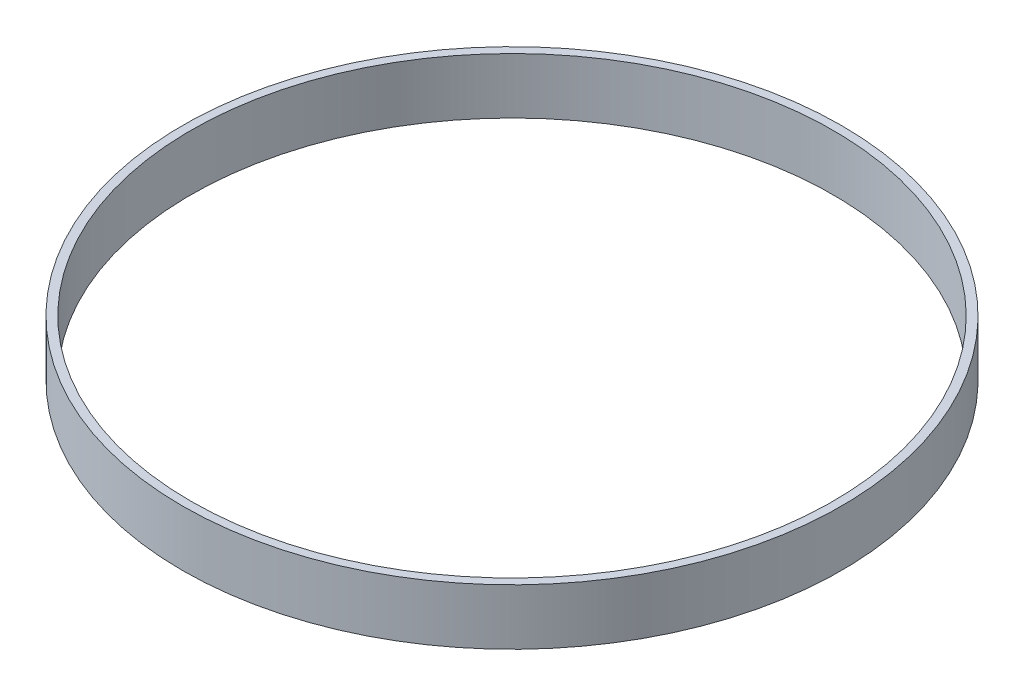
ISO-10303-21;
HEADER;
FILE_DESCRIPTION(('STEP AP214'),'2;1');
FILE_NAME('part.step','',(''),(''),'','','');
FILE_SCHEMA(('AUTOMOTIVE_DESIGN { 1 0 10303 214 1 1 1 1 }'));
ENDSEC;
DATA;
#1=APPLICATION_CONTEXT('core data for automotive mechanical design processes');
#2=APPLICATION_PROTOCOL_DEFINITION('international standard','automotive_design',2000,#1);
#3=PRODUCT_CONTEXT('',#1,'mechanical');
#4=PRODUCT('Part','Part','',(#3));
#5=PRODUCT_RELATED_PRODUCT_CATEGORY('part','',(#4));
#6=PRODUCT_DEFINITION_FORMATION('','',#4);
#7=PRODUCT_DEFINITION_CONTEXT('part definition',#1,'design');
#8=PRODUCT_DEFINITION('design','',#6,#7);
#9=PRODUCT_DEFINITION_SHAPE('','',#8);
#10=(LENGTH_UNIT() NAMED_UNIT(*) SI_UNIT(.MILLI.,.METRE.));
#11=(NAMED_UNIT(*) PLANE_ANGLE_UNIT() SI_UNIT($,.RADIAN.));
#12=(NAMED_UNIT(*) SI_UNIT($,.STERADIAN.) SOLID_ANGLE_UNIT());
#13=UNCERTAINTY_MEASURE_WITH_UNIT(LENGTH_MEASURE(1.E-05),#10,'distance_accuracy_value','');
#14=(GEOMETRIC_REPRESENTATION_CONTEXT(3) GLOBAL_UNCERTAINTY_ASSIGNED_CONTEXT((#13)) GLOBAL_UNIT_ASSIGNED_CONTEXT((#10,
#11,#12)) REPRESENTATION_CONTEXT('',''));
#15=CARTESIAN_POINT('',(0.,0.,0.));
#16=DIRECTION('',(0.,0.,1.));
#17=DIRECTION('',(1.,0.,0.));
#18=AXIS2_PLACEMENT_3D('',#15,#16,#17);
#19=CARTESIAN_POINT('',(0.,10.,0.));
#20=DIRECTION('',(0.,1.,0.));
#21=DIRECTION('',(0.,0.,1.));
#22=AXIS2_PLACEMENT_3D('',#19,#20,#21);
#23=PLANE('',#22);
#24=CARTESIAN_POINT('',(0.,10.,0.));
#25=DIRECTION('',(0.,1.,0.));
#26=DIRECTION('',(0.,0.,1.));
#27=AXIS2_PLACEMENT_3D('',#24,#25,#26);
#28=CIRCLE('',#27,59.);
#29=CARTESIAN_POINT('',(0.,10.,59.));
#30=VERTEX_POINT('',#29);
#31=EDGE_CURVE('E10',#30,#30,#28,.T.);
#32=ORIENTED_EDGE('',*,*,#31,.T.);
#33=EDGE_LOOP('',(#32));
#34=FACE_BOUND('',#33,.T.);
#35=CARTESIAN_POINT('',(0.,10.,0.));
#36=DIRECTION('',(0.,1.,0.));
#37=DIRECTION('',(0.,0.,1.));
#38=AXIS2_PLACEMENT_3D('',#35,#36,#37);
#39=CIRCLE('',#38,57.5);
#40=CARTESIAN_POINT('',(0.,10.,57.5));
#41=VERTEX_POINT('',#40);
#42=EDGE_CURVE('E55',#41,#41,#39,.T.);
#43=ORIENTED_EDGE('',*,*,#42,.F.);
#44=EDGE_LOOP('',(#43));
#45=FACE_BOUND('',#44,.T.);
#46=ADVANCED_FACE('F41',(#34,#45),#23,.T.);
#47=CARTESIAN_POINT('',(0.,0.,0.));
#48=DIRECTION('',(0.,1.,0.));
#49=DIRECTION('',(0.,0.,1.));
#50=AXIS2_PLACEMENT_3D('',#47,#48,#49);
#51=PLANE('',#50);
#52=CARTESIAN_POINT('',(0.,0.,0.));
#53=DIRECTION('',(0.,1.,0.));
#54=DIRECTION('',(0.,0.,1.));
#55=AXIS2_PLACEMENT_3D('',#52,#53,#54);
#56=CIRCLE('',#55,59.);
#57=CARTESIAN_POINT('',(0.,0.,59.));
#58=VERTEX_POINT('',#57);
#59=EDGE_CURVE('E45',#58,#58,#56,.T.);
#60=ORIENTED_EDGE('',*,*,#59,.F.);
#61=EDGE_LOOP('',(#60));
#62=FACE_BOUND('',#61,.T.);
#63=CARTESIAN_POINT('',(0.,0.,0.));
#64=DIRECTION('',(0.,1.,0.));
#65=DIRECTION('',(0.,0.,1.));
#66=AXIS2_PLACEMENT_3D('',#63,#64,#65);
#67=CIRCLE('',#66,57.5);
#68=CARTESIAN_POINT('',(0.,0.,57.5));
#69=VERTEX_POINT('',#68);
#70=EDGE_CURVE('E57',#69,#69,#67,.T.);
#71=ORIENTED_EDGE('',*,*,#70,.T.);
#72=EDGE_LOOP('',(#71));
#73=FACE_BOUND('',#72,.T.);
#74=ADVANCED_FACE('F68',(#62,#73),#51,.F.);
#75=CARTESIAN_POINT('',(0.,10.,0.));
#76=DIRECTION('',(0.,-1.,0.));
#77=DIRECTION('',(0.,0.,-1.));
#78=AXIS2_PLACEMENT_3D('',#75,#76,#77);
#79=CYLINDRICAL_SURFACE('',#78,59.);
#80=ORIENTED_EDGE('',*,*,#31,.F.);
#81=EDGE_LOOP('',(#80));
#82=FACE_BOUND('',#81,.T.);
#83=ORIENTED_EDGE('',*,*,#59,.T.);
#84=EDGE_LOOP('',(#83));
#85=FACE_BOUND('',#84,.T.);
#86=ADVANCED_FACE('F43',(#82,#85),#79,.T.);
#87=CARTESIAN_POINT('',(0.,10.,0.));
#88=DIRECTION('',(0.,-1.,0.));
#89=DIRECTION('',(0.,0.,-1.));
#90=AXIS2_PLACEMENT_3D('',#87,#88,#89);
#91=CYLINDRICAL_SURFACE('',#90,57.5);
#92=ORIENTED_EDGE('',*,*,#42,.T.);
#93=EDGE_LOOP('',(#92));
#94=FACE_BOUND('',#93,.T.);
#95=ORIENTED_EDGE('',*,*,#70,.F.);
#96=EDGE_LOOP('',(#95));
#97=FACE_BOUND('',#96,.T.);
#98=ADVANCED_FACE('F64',(#94,#97),#91,.F.);
#99=CLOSED_SHELL('',(#46,#74,#86,#98));
#100=MANIFOLD_SOLID_BREP('B2',#99);
#101=ADVANCED_BREP_SHAPE_REPRESENTATION('',(#18,#100),#14);
#102=SHAPE_DEFINITION_REPRESENTATION(#9,#101);
ENDSEC;
END-ISO-10303-21;
